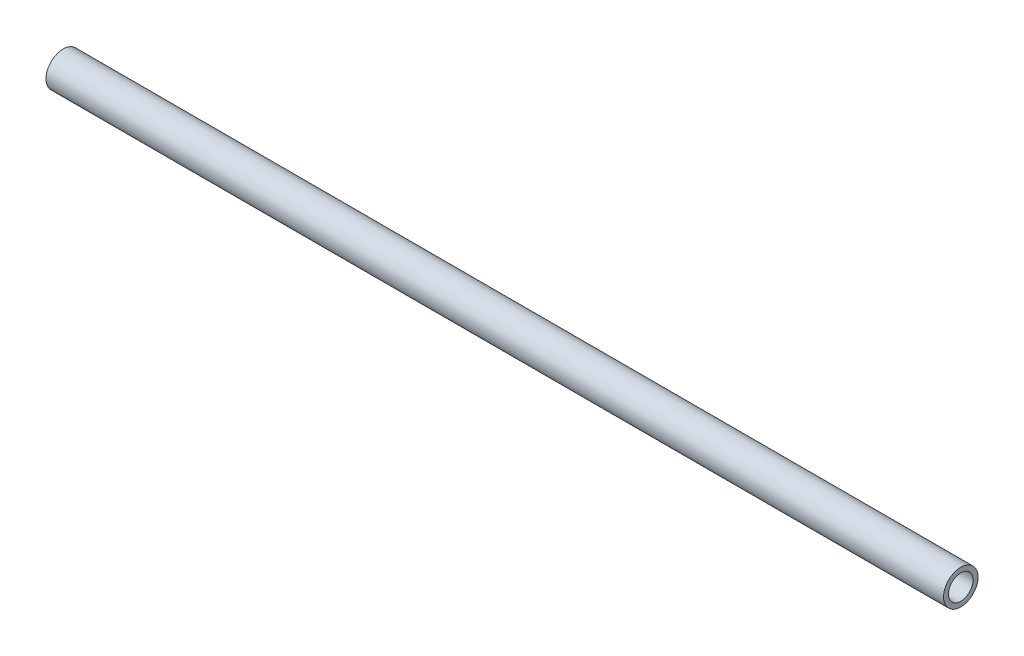
ISO-10303-21;
HEADER;
FILE_DESCRIPTION(('STEP AP214'),'2;1');
FILE_NAME('part.step','',(''),(''),'','','');
FILE_SCHEMA(('AUTOMOTIVE_DESIGN { 1 0 10303 214 1 1 1 1 }'));
ENDSEC;
DATA;
#1=APPLICATION_CONTEXT('core data for automotive mechanical design processes');
#2=APPLICATION_PROTOCOL_DEFINITION('international standard','automotive_design',2000,#1);
#3=PRODUCT_CONTEXT('',#1,'mechanical');
#4=PRODUCT('Part','Part','',(#3));
#5=PRODUCT_RELATED_PRODUCT_CATEGORY('part','',(#4));
#6=PRODUCT_DEFINITION_FORMATION('','',#4);
#7=PRODUCT_DEFINITION_CONTEXT('part definition',#1,'design');
#8=PRODUCT_DEFINITION('design','',#6,#7);
#9=PRODUCT_DEFINITION_SHAPE('','',#8);
#10=(LENGTH_UNIT() NAMED_UNIT(*) SI_UNIT(.MILLI.,.METRE.));
#11=(NAMED_UNIT(*) PLANE_ANGLE_UNIT() SI_UNIT($,.RADIAN.));
#12=(NAMED_UNIT(*) SI_UNIT($,.STERADIAN.) SOLID_ANGLE_UNIT());
#13=UNCERTAINTY_MEASURE_WITH_UNIT(LENGTH_MEASURE(1.E-05),#10,'distance_accuracy_value','');
#14=(GEOMETRIC_REPRESENTATION_CONTEXT(3) GLOBAL_UNCERTAINTY_ASSIGNED_CONTEXT((#13)) GLOBAL_UNIT_ASSIGNED_CONTEXT((#10,
#11,#12)) REPRESENTATION_CONTEXT('',''));
#15=CARTESIAN_POINT('',(0.,0.,0.));
#16=DIRECTION('',(0.,0.,1.));
#17=DIRECTION('',(1.,0.,0.));
#18=AXIS2_PLACEMENT_3D('',#15,#16,#17);
#19=CARTESIAN_POINT('',(579.120000000001,0.,0.));
#20=DIRECTION('',(1.,0.,0.));
#21=DIRECTION('',(0.,0.,-1.));
#22=AXIS2_PLACEMENT_3D('',#19,#20,#21);
#23=PLANE('',#22);
#24=CARTESIAN_POINT('',(579.120000000001,0.,0.));
#25=DIRECTION('',(1.,0.,0.));
#26=DIRECTION('',(0.,0.,-1.));
#27=AXIS2_PLACEMENT_3D('',#24,#25,#26);
#28=CIRCLE('',#27,22.2504);
#29=CARTESIAN_POINT('',(579.120000000001,0.,22.2504));
#30=VERTEX_POINT('',#29);
#31=EDGE_CURVE('E11',#30,#30,#28,.T.);
#32=ORIENTED_EDGE('',*,*,#31,.T.);
#33=EDGE_LOOP('',(#32));
#34=FACE_BOUND('',#33,.T.);
#35=CARTESIAN_POINT('',(579.120000000001,0.,0.));
#36=DIRECTION('',(1.,0.,0.));
#37=DIRECTION('',(0.,0.,-1.));
#38=AXIS2_PLACEMENT_3D('',#35,#36,#37);
#39=CIRCLE('',#38,15.875);
#40=CARTESIAN_POINT('',(579.120000000001,0.,15.875));
#41=VERTEX_POINT('',#40);
#42=EDGE_CURVE('E52',#41,#41,#39,.T.);
#43=ORIENTED_EDGE('',*,*,#42,.F.);
#44=EDGE_LOOP('',(#43));
#45=FACE_BOUND('',#44,.T.);
#46=ADVANCED_FACE('F41',(#34,#45),#23,.T.);
#47=CARTESIAN_POINT('',(-579.120000000001,0.,0.));
#48=DIRECTION('',(1.,0.,0.));
#49=DIRECTION('',(0.,0.,-1.));
#50=AXIS2_PLACEMENT_3D('',#47,#48,#49);
#51=PLANE('',#50);
#52=CARTESIAN_POINT('',(-579.120000000001,0.,0.));
#53=DIRECTION('',(1.,0.,0.));
#54=DIRECTION('',(0.,0.,-1.));
#55=AXIS2_PLACEMENT_3D('',#52,#53,#54);
#56=CIRCLE('',#55,22.2504);
#57=CARTESIAN_POINT('',(-579.120000000001,0.,22.2504));
#58=VERTEX_POINT('',#57);
#59=EDGE_CURVE('E45',#58,#58,#56,.T.);
#60=ORIENTED_EDGE('',*,*,#59,.F.);
#61=EDGE_LOOP('',(#60));
#62=FACE_BOUND('',#61,.T.);
#63=CARTESIAN_POINT('',(-579.120000000001,0.,0.));
#64=DIRECTION('',(1.,0.,0.));
#65=DIRECTION('',(0.,0.,-1.));
#66=AXIS2_PLACEMENT_3D('',#63,#64,#65);
#67=CIRCLE('',#66,15.875);
#68=CARTESIAN_POINT('',(-579.120000000001,0.,15.875));
#69=VERTEX_POINT('',#68);
#70=EDGE_CURVE('E54',#69,#69,#67,.T.);
#71=ORIENTED_EDGE('',*,*,#70,.T.);
#72=EDGE_LOOP('',(#71));
#73=FACE_BOUND('',#72,.T.);
#74=ADVANCED_FACE('F64',(#62,#73),#51,.F.);
#75=CARTESIAN_POINT('',(579.120000000001,0.,0.));
#76=DIRECTION('',(-1.,0.,0.));
#77=DIRECTION('',(0.,0.,1.));
#78=AXIS2_PLACEMENT_3D('',#75,#76,#77);
#79=CYLINDRICAL_SURFACE('',#78,22.2504);
#80=CARTESIAN_POINT('',(579.120000000001,0.,22.2504));
#81=CARTESIAN_POINT('',(567.055000000001,0.,22.2504));
#82=CARTESIAN_POINT('',(554.990000000001,0.,22.2504));
#83=CARTESIAN_POINT('',(530.860000000001,0.,22.2504));
#84=CARTESIAN_POINT('',(518.795000000001,0.,22.2504));
#85=CARTESIAN_POINT('',(494.665000000001,0.,22.2504));
#86=CARTESIAN_POINT('',(482.600000000001,0.,22.2504));
#87=CARTESIAN_POINT('',(458.470000000001,0.,22.2504));
#88=CARTESIAN_POINT('',(446.405,0.,22.2504));
#89=CARTESIAN_POINT('',(422.275,0.,22.2504));
#90=CARTESIAN_POINT('',(410.21,0.,22.2504));
#91=CARTESIAN_POINT('',(386.08,0.,22.2504));
#92=CARTESIAN_POINT('',(374.015,0.,22.2504));
#93=CARTESIAN_POINT('',(349.885,0.,22.2504));
#94=CARTESIAN_POINT('',(337.82,0.,22.2504));
#95=CARTESIAN_POINT('',(313.69,0.,22.2504));
#96=CARTESIAN_POINT('',(301.625,0.,22.2504));
#97=CARTESIAN_POINT('',(277.495,0.,22.2504));
#98=CARTESIAN_POINT('',(265.43,0.,22.2504));
#99=CARTESIAN_POINT('',(241.3,0.,22.2504));
#100=CARTESIAN_POINT('',(229.235,0.,22.2504));
#101=CARTESIAN_POINT('',(205.105,0.,22.2504));
#102=CARTESIAN_POINT('',(193.04,0.,22.2504));
#103=CARTESIAN_POINT('',(168.91,0.,22.2504));
#104=CARTESIAN_POINT('',(156.845,0.,22.2504));
#105=CARTESIAN_POINT('',(132.715,0.,22.2504));
#106=CARTESIAN_POINT('',(120.65,0.,22.2504));
#107=CARTESIAN_POINT('',(96.52,0.,22.2504));
#108=CARTESIAN_POINT('',(84.455,0.,22.2504));
#109=CARTESIAN_POINT('',(60.325,0.,22.2504));
#110=CARTESIAN_POINT('',(48.26,0.,22.2504));
#111=CARTESIAN_POINT('',(24.1299999999999,0.,22.2504));
#112=CARTESIAN_POINT('',(12.0649999999999,0.,22.2504));
#113=CARTESIAN_POINT('',(-12.0650000000001,0.,22.2504));
#114=CARTESIAN_POINT('',(-24.1300000000002,0.,22.2504));
#115=CARTESIAN_POINT('',(-48.2600000000002,0.,22.2504));
#116=CARTESIAN_POINT('',(-60.3250000000003,0.,22.2504));
#117=CARTESIAN_POINT('',(-84.4550000000003,0.,22.2504));
#118=CARTESIAN_POINT('',(-96.5200000000003,0.,22.2504));
#119=CARTESIAN_POINT('',(-120.65,0.,22.2504));
#120=CARTESIAN_POINT('',(-132.715,0.,22.2504));
#121=CARTESIAN_POINT('',(-156.845,0.,22.2504));
#122=CARTESIAN_POINT('',(-168.91,0.,22.2504));
#123=CARTESIAN_POINT('',(-193.04,0.,22.2504));
#124=CARTESIAN_POINT('',(-205.105,0.,22.2504));
#125=CARTESIAN_POINT('',(-229.235,0.,22.2504));
#126=CARTESIAN_POINT('',(-241.3,0.,22.2504));
#127=CARTESIAN_POINT('',(-265.430000000001,0.,22.2504));
#128=CARTESIAN_POINT('',(-277.495000000001,0.,22.2504));
#129=CARTESIAN_POINT('',(-301.625000000001,0.,22.2504));
#130=CARTESIAN_POINT('',(-313.690000000001,0.,22.2504));
#131=CARTESIAN_POINT('',(-337.820000000001,0.,22.2504));
#132=CARTESIAN_POINT('',(-349.885000000001,0.,22.2504));
#133=CARTESIAN_POINT('',(-374.015000000001,0.,22.2504));
#134=CARTESIAN_POINT('',(-386.080000000001,0.,22.2504));
#135=CARTESIAN_POINT('',(-410.210000000001,0.,22.2504));
#136=CARTESIAN_POINT('',(-422.275000000001,0.,22.2504));
#137=CARTESIAN_POINT('',(-446.405000000001,0.,22.2504));
#138=CARTESIAN_POINT('',(-458.470000000001,0.,22.2504));
#139=CARTESIAN_POINT('',(-482.600000000001,0.,22.2504));
#140=CARTESIAN_POINT('',(-494.665000000001,0.,22.2504));
#141=CARTESIAN_POINT('',(-518.795000000001,0.,22.2504));
#142=CARTESIAN_POINT('',(-530.860000000001,0.,22.2504));
#143=CARTESIAN_POINT('',(-554.990000000001,0.,22.2504));
#144=CARTESIAN_POINT('',(-567.055000000001,0.,22.2504));
#145=CARTESIAN_POINT('',(-579.120000000001,0.,22.2504));
#146=B_SPLINE_CURVE_WITH_KNOTS('',3,(#80,#81,#82,#83,#84,#85,#86,#87,#88,#89,#90,#91,#92,#93,
#94,#95,#96,#97,#98,#99,#100,#101,#102,#103,#104,#105,#106,#107,#108,#109,#110,#111,#112,#113,
#114,#115,#116,#117,#118,#119,#120,#121,#122,#123,#124,#125,#126,#127,#128,#129,#130,#131,#132,
#133,#134,#135,#136,#137,#138,#139,#140,#141,#142,#143,#144,#145),.UNSPECIFIED.,.F.,.F.,(4,2,2,
2,2,2,2,2,2,2,2,2,2,2,2,2,2,2,2,2,2,2,2,2,2,2,2,2,2,2,2,2,4),(0.,36.1950000000001,
72.3900000000002,108.585,144.78,180.975,217.17,253.365,289.56,325.755000000001,361.950000000001,
398.145000000001,434.340000000001,470.535000000001,506.730000000001,542.925000000001,
579.120000000001,615.315000000001,651.510000000001,687.705000000001,723.900000000001,
760.095000000001,796.290000000001,832.485000000001,868.680000000001,904.875000000001,
941.070000000002,977.265000000001,1013.46,1049.655,1085.85,1122.045,1158.24),.UNSPECIFIED.);
#147=EDGE_CURVE('BSEAM43',#30,#58,#146,.T.);
#148=ORIENTED_EDGE('',*,*,#31,.F.);
#149=ORIENTED_EDGE('',*,*,#59,.T.);
#150=ORIENTED_EDGE('',*,*,#147,.T.);
#151=ORIENTED_EDGE('',*,*,#147,.F.);
#152=EDGE_LOOP('',(#148,#150,#149,#151));
#153=FACE_BOUND('',#152,.T.);
#154=ADVANCED_FACE('F43',(#153),#79,.T.);
#155=CARTESIAN_POINT('',(579.120000000001,0.,0.));
#156=DIRECTION('',(-1.,0.,0.));
#157=DIRECTION('',(0.,0.,1.));
#158=AXIS2_PLACEMENT_3D('',#155,#156,#157);
#159=CYLINDRICAL_SURFACE('',#158,15.875);
#160=CARTESIAN_POINT('',(579.120000000001,0.,15.875));
#161=CARTESIAN_POINT('',(567.055000000001,0.,15.875));
#162=CARTESIAN_POINT('',(554.990000000001,0.,15.875));
#163=CARTESIAN_POINT('',(530.860000000001,0.,15.875));
#164=CARTESIAN_POINT('',(518.795000000001,0.,15.875));
#165=CARTESIAN_POINT('',(494.665000000001,0.,15.875));
#166=CARTESIAN_POINT('',(482.600000000001,0.,15.875));
#167=CARTESIAN_POINT('',(458.470000000001,0.,15.875));
#168=CARTESIAN_POINT('',(446.405,0.,15.875));
#169=CARTESIAN_POINT('',(422.275,0.,15.875));
#170=CARTESIAN_POINT('',(410.21,0.,15.875));
#171=CARTESIAN_POINT('',(386.08,0.,15.875));
#172=CARTESIAN_POINT('',(374.015,0.,15.875));
#173=CARTESIAN_POINT('',(349.885,0.,15.875));
#174=CARTESIAN_POINT('',(337.82,0.,15.875));
#175=CARTESIAN_POINT('',(313.69,0.,15.875));
#176=CARTESIAN_POINT('',(301.625,0.,15.875));
#177=CARTESIAN_POINT('',(277.495,0.,15.875));
#178=CARTESIAN_POINT('',(265.43,0.,15.875));
#179=CARTESIAN_POINT('',(241.3,0.,15.875));
#180=CARTESIAN_POINT('',(229.235,0.,15.875));
#181=CARTESIAN_POINT('',(205.105,0.,15.875));
#182=CARTESIAN_POINT('',(193.04,0.,15.875));
#183=CARTESIAN_POINT('',(168.91,0.,15.875));
#184=CARTESIAN_POINT('',(156.845,0.,15.875));
#185=CARTESIAN_POINT('',(132.715,0.,15.875));
#186=CARTESIAN_POINT('',(120.65,0.,15.875));
#187=CARTESIAN_POINT('',(96.52,0.,15.875));
#188=CARTESIAN_POINT('',(84.455,0.,15.875));
#189=CARTESIAN_POINT('',(60.325,0.,15.875));
#190=CARTESIAN_POINT('',(48.26,0.,15.875));
#191=CARTESIAN_POINT('',(24.1299999999999,0.,15.875));
#192=CARTESIAN_POINT('',(12.0649999999999,0.,15.875));
#193=CARTESIAN_POINT('',(-12.0650000000001,0.,15.875));
#194=CARTESIAN_POINT('',(-24.1300000000002,0.,15.875));
#195=CARTESIAN_POINT('',(-48.2600000000002,0.,15.875));
#196=CARTESIAN_POINT('',(-60.3250000000003,0.,15.875));
#197=CARTESIAN_POINT('',(-84.4550000000003,0.,15.875));
#198=CARTESIAN_POINT('',(-96.5200000000003,0.,15.875));
#199=CARTESIAN_POINT('',(-120.65,0.,15.875));
#200=CARTESIAN_POINT('',(-132.715,0.,15.875));
#201=CARTESIAN_POINT('',(-156.845,0.,15.875));
#202=CARTESIAN_POINT('',(-168.91,0.,15.875));
#203=CARTESIAN_POINT('',(-193.04,0.,15.875));
#204=CARTESIAN_POINT('',(-205.105,0.,15.875));
#205=CARTESIAN_POINT('',(-229.235,0.,15.875));
#206=CARTESIAN_POINT('',(-241.3,0.,15.875));
#207=CARTESIAN_POINT('',(-265.430000000001,0.,15.875));
#208=CARTESIAN_POINT('',(-277.495000000001,0.,15.875));
#209=CARTESIAN_POINT('',(-301.625000000001,0.,15.875));
#210=CARTESIAN_POINT('',(-313.690000000001,0.,15.875));
#211=CARTESIAN_POINT('',(-337.820000000001,0.,15.875));
#212=CARTESIAN_POINT('',(-349.885000000001,0.,15.875));
#213=CARTESIAN_POINT('',(-374.015000000001,0.,15.875));
#214=CARTESIAN_POINT('',(-386.080000000001,0.,15.875));
#215=CARTESIAN_POINT('',(-410.210000000001,0.,15.875));
#216=CARTESIAN_POINT('',(-422.275000000001,0.,15.875));
#217=CARTESIAN_POINT('',(-446.405000000001,0.,15.875));
#218=CARTESIAN_POINT('',(-458.470000000001,0.,15.875));
#219=CARTESIAN_POINT('',(-482.600000000001,0.,15.875));
#220=CARTESIAN_POINT('',(-494.665000000001,0.,15.875));
#221=CARTESIAN_POINT('',(-518.795000000001,0.,15.875));
#222=CARTESIAN_POINT('',(-530.860000000001,0.,15.875));
#223=CARTESIAN_POINT('',(-554.990000000001,0.,15.875));
#224=CARTESIAN_POINT('',(-567.055000000001,0.,15.875));
#225=CARTESIAN_POINT('',(-579.120000000001,0.,15.875));
#226=B_SPLINE_CURVE_WITH_KNOTS('',3,(#160,#161,#162,#163,#164,#165,#166,#167,#168,#169,#170,
#171,#172,#173,#174,#175,#176,#177,#178,#179,#180,#181,#182,#183,#184,#185,#186,#187,#188,#189,
#190,#191,#192,#193,#194,#195,#196,#197,#198,#199,#200,#201,#202,#203,#204,#205,#206,#207,#208,
#209,#210,#211,#212,#213,#214,#215,#216,#217,#218,#219,#220,#221,#222,#223,#224,#225),
.UNSPECIFIED.,.F.,.F.,(4,2,2,2,2,2,2,2,2,2,2,2,2,2,2,2,2,2,2,2,2,2,2,2,2,2,2,2,2,2,2,2,4),(0.,
36.1950000000001,72.3900000000002,108.585,144.78,180.975,217.17,253.365,289.56,325.755000000001,
361.950000000001,398.145000000001,434.340000000001,470.535000000001,506.730000000001,
542.925000000001,579.120000000001,615.315000000001,651.510000000001,687.705000000001,
723.900000000001,760.095000000001,796.290000000001,832.485000000001,868.680000000001,
904.875000000001,941.070000000002,977.265000000001,1013.46,1049.655,1085.85,1122.045,1158.24),.UNSPECIFIED.);
#227=EDGE_CURVE('BSEAM60',#41,#69,#226,.T.);
#228=ORIENTED_EDGE('',*,*,#42,.T.);
#229=ORIENTED_EDGE('',*,*,#70,.F.);
#230=ORIENTED_EDGE('',*,*,#227,.T.);
#231=ORIENTED_EDGE('',*,*,#227,.F.);
#232=EDGE_LOOP('',(#228,#230,#229,#231));
#233=FACE_BOUND('',#232,.T.);
#234=ADVANCED_FACE('F60',(#233),#159,.F.);
#235=CLOSED_SHELL('',(#46,#74,#154,#234));
#236=MANIFOLD_SOLID_BREP('B2',#235);
#237=ADVANCED_BREP_SHAPE_REPRESENTATION('',(#18,#236),#14);
#238=SHAPE_DEFINITION_REPRESENTATION(#9,#237);
ENDSEC;
END-ISO-10303-21;
